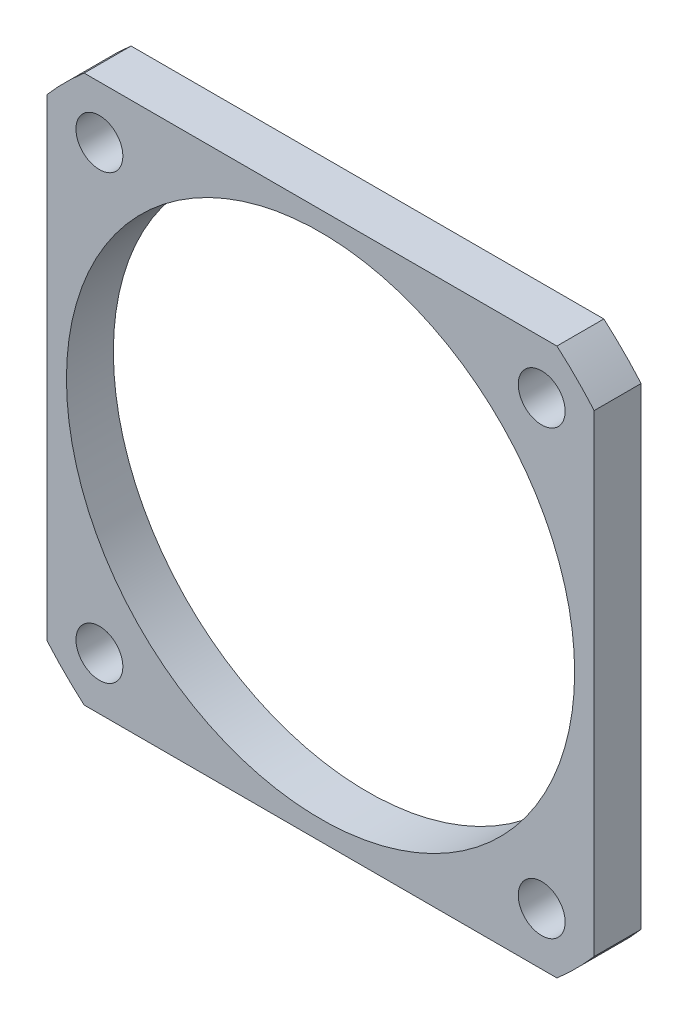
ISO-10303-21;
HEADER;
FILE_DESCRIPTION(('STEP AP214'),'2;1');
FILE_NAME('part.step','',(''),(''),'','','');
FILE_SCHEMA(('AUTOMOTIVE_DESIGN { 1 0 10303 214 1 1 1 1 }'));
ENDSEC;
DATA;
#1=APPLICATION_CONTEXT('core data for automotive mechanical design processes');
#2=APPLICATION_PROTOCOL_DEFINITION('international standard','automotive_design',2000,#1);
#3=PRODUCT_CONTEXT('',#1,'mechanical');
#4=PRODUCT('Part','Part','',(#3));
#5=PRODUCT_RELATED_PRODUCT_CATEGORY('part','',(#4));
#6=PRODUCT_DEFINITION_FORMATION('','',#4);
#7=PRODUCT_DEFINITION_CONTEXT('part definition',#1,'design');
#8=PRODUCT_DEFINITION('design','',#6,#7);
#9=PRODUCT_DEFINITION_SHAPE('','',#8);
#10=(LENGTH_UNIT() NAMED_UNIT(*) SI_UNIT(.MILLI.,.METRE.));
#11=(NAMED_UNIT(*) PLANE_ANGLE_UNIT() SI_UNIT($,.RADIAN.));
#12=(NAMED_UNIT(*) SI_UNIT($,.STERADIAN.) SOLID_ANGLE_UNIT());
#13=UNCERTAINTY_MEASURE_WITH_UNIT(LENGTH_MEASURE(1.E-05),#10,'distance_accuracy_value','');
#14=(GEOMETRIC_REPRESENTATION_CONTEXT(3) GLOBAL_UNCERTAINTY_ASSIGNED_CONTEXT((#13)) GLOBAL_UNIT_ASSIGNED_CONTEXT((#10,
#11,#12)) REPRESENTATION_CONTEXT('',''));
#15=CARTESIAN_POINT('',(0.,0.,0.));
#16=DIRECTION('',(0.,0.,1.));
#17=DIRECTION('',(1.,0.,0.));
#18=AXIS2_PLACEMENT_3D('',#15,#16,#17);
#19=CARTESIAN_POINT('',(0.,0.,12.));
#20=DIRECTION('',(0.,0.,-1.));
#21=DIRECTION('',(-1.,0.,0.));
#22=AXIS2_PLACEMENT_3D('',#19,#20,#21);
#23=CYLINDRICAL_SURFACE('',#22,92.5);
#24=DIRECTION('',(0.,0.,-1.));
#25=VECTOR('',#24,1.);
#26=CARTESIAN_POINT('',(-70.,60.4669331122391,12.));
#27=LINE('',#26,#25);
#28=CARTESIAN_POINT('',(-70.,60.4669331122391,12.));
#29=VERTEX_POINT('',#28);
#30=CARTESIAN_POINT('',(-70.,60.4669331122391,0.));
#31=VERTEX_POINT('',#30);
#32=EDGE_CURVE('E127',#29,#31,#27,.T.);
#33=ORIENTED_EDGE('',*,*,#32,.F.);
#34=CARTESIAN_POINT('',(0.,0.,12.));
#35=DIRECTION('',(0.,0.,1.));
#36=DIRECTION('',(1.,0.,0.));
#37=AXIS2_PLACEMENT_3D('',#34,#35,#36);
#38=CIRCLE('',#37,92.5);
#39=CARTESIAN_POINT('',(-60.4669331122391,70.,12.));
#40=VERTEX_POINT('',#39);
#41=EDGE_CURVE('E118',#40,#29,#38,.T.);
#42=ORIENTED_EDGE('',*,*,#41,.F.);
#43=DIRECTION('',(0.,0.,-1.));
#44=VECTOR('',#43,1.);
#45=CARTESIAN_POINT('',(-60.4669331122391,70.,12.));
#46=LINE('',#45,#44);
#47=CARTESIAN_POINT('',(-60.4669331122391,70.,0.));
#48=VERTEX_POINT('',#47);
#49=EDGE_CURVE('E139',#48,#40,#46,.F.);
#50=ORIENTED_EDGE('',*,*,#49,.F.);
#51=CARTESIAN_POINT('',(0.,0.,0.));
#52=DIRECTION('',(0.,0.,1.));
#53=DIRECTION('',(1.,0.,0.));
#54=AXIS2_PLACEMENT_3D('',#51,#52,#53);
#55=CIRCLE('',#54,92.5);
#56=EDGE_CURVE('E131',#48,#31,#55,.T.);
#57=ORIENTED_EDGE('',*,*,#56,.T.);
#58=EDGE_LOOP('',(#33,#42,#50,#57));
#59=FACE_BOUND('',#58,.T.);
#60=ADVANCED_FACE('F33',(#59),#23,.T.);
#61=DIRECTION('',(0.,0.,-1.));
#62=VECTOR('',#61,1.);
#63=CARTESIAN_POINT('',(-70.,-60.4669331122391,12.));
#64=LINE('',#63,#62);
#65=CARTESIAN_POINT('',(-70.,-60.4669331122391,0.));
#66=VERTEX_POINT('',#65);
#67=CARTESIAN_POINT('',(-70.,-60.4669331122391,12.));
#68=VERTEX_POINT('',#67);
#69=EDGE_CURVE('E156',#66,#68,#64,.F.);
#70=ORIENTED_EDGE('',*,*,#69,.F.);
#71=CARTESIAN_POINT('',(-60.4669331122391,-70.,0.));
#72=VERTEX_POINT('',#71);
#73=EDGE_CURVE('E112',#66,#72,#55,.T.);
#74=ORIENTED_EDGE('',*,*,#73,.T.);
#75=DIRECTION('',(0.,0.,-1.));
#76=VECTOR('',#75,1.);
#77=CARTESIAN_POINT('',(-60.4669331122391,-70.,12.));
#78=LINE('',#77,#76);
#79=CARTESIAN_POINT('',(-60.4669331122391,-70.,12.));
#80=VERTEX_POINT('',#79);
#81=EDGE_CURVE('E55',#80,#72,#78,.T.);
#82=ORIENTED_EDGE('',*,*,#81,.F.);
#83=EDGE_CURVE('E110',#68,#80,#38,.T.);
#84=ORIENTED_EDGE('',*,*,#83,.F.);
#85=EDGE_LOOP('',(#70,#74,#82,#84));
#86=FACE_BOUND('',#85,.T.);
#87=ADVANCED_FACE('F109',(#86),#23,.T.);
#88=DIRECTION('',(0.,0.,-1.));
#89=VECTOR('',#88,1.);
#90=CARTESIAN_POINT('',(60.4669331122391,70.,12.));
#91=LINE('',#90,#89);
#92=CARTESIAN_POINT('',(60.4669331122391,70.,12.));
#93=VERTEX_POINT('',#92);
#94=CARTESIAN_POINT('',(60.4669331122391,70.,0.));
#95=VERTEX_POINT('',#94);
#96=EDGE_CURVE('E142',#93,#95,#91,.T.);
#97=ORIENTED_EDGE('',*,*,#96,.F.);
#98=CARTESIAN_POINT('',(70.,60.4669331122391,12.));
#99=VERTEX_POINT('',#98);
#100=EDGE_CURVE('E121',#99,#93,#38,.T.);
#101=ORIENTED_EDGE('',*,*,#100,.F.);
#102=DIRECTION('',(0.,0.,-1.));
#103=VECTOR('',#102,1.);
#104=CARTESIAN_POINT('',(70.,60.4669331122391,12.));
#105=LINE('',#104,#103);
#106=CARTESIAN_POINT('',(70.,60.4669331122391,0.));
#107=VERTEX_POINT('',#106);
#108=EDGE_CURVE('E113',#107,#99,#105,.F.);
#109=ORIENTED_EDGE('',*,*,#108,.F.);
#110=EDGE_CURVE('E122',#107,#95,#55,.T.);
#111=ORIENTED_EDGE('',*,*,#110,.T.);
#112=EDGE_LOOP('',(#97,#101,#109,#111));
#113=FACE_BOUND('',#112,.T.);
#114=ADVANCED_FACE('F233',(#113),#23,.T.);
#115=DIRECTION('',(0.,0.,-1.));
#116=VECTOR('',#115,1.);
#117=CARTESIAN_POINT('',(70.,-60.4669331122391,12.));
#118=LINE('',#117,#116);
#119=CARTESIAN_POINT('',(70.,-60.4669331122391,12.));
#120=VERTEX_POINT('',#119);
#121=CARTESIAN_POINT('',(70.,-60.4669331122391,0.));
#122=VERTEX_POINT('',#121);
#123=EDGE_CURVE('E47',#120,#122,#118,.T.);
#124=ORIENTED_EDGE('',*,*,#123,.F.);
#125=CARTESIAN_POINT('',(60.4669331122391,-70.,12.));
#126=VERTEX_POINT('',#125);
#127=EDGE_CURVE('E119',#126,#120,#38,.T.);
#128=ORIENTED_EDGE('',*,*,#127,.F.);
#129=DIRECTION('',(0.,0.,-1.));
#130=VECTOR('',#129,1.);
#131=CARTESIAN_POINT('',(60.4669331122391,-70.,12.));
#132=LINE('',#131,#130);
#133=CARTESIAN_POINT('',(60.4669331122391,-70.,0.));
#134=VERTEX_POINT('',#133);
#135=EDGE_CURVE('E97',#134,#126,#132,.F.);
#136=ORIENTED_EDGE('',*,*,#135,.F.);
#137=EDGE_CURVE('E132',#134,#122,#55,.T.);
#138=ORIENTED_EDGE('',*,*,#137,.T.);
#139=EDGE_LOOP('',(#124,#128,#136,#138));
#140=FACE_BOUND('',#139,.T.);
#141=ADVANCED_FACE('F203',(#140),#23,.T.);
#142=CARTESIAN_POINT('',(0.,0.,12.));
#143=DIRECTION('',(0.,0.,1.));
#144=DIRECTION('',(1.,0.,0.));
#145=AXIS2_PLACEMENT_3D('',#142,#143,#144);
#146=PLANE('',#145);
#147=CARTESIAN_POINT('',(56.5685424949237,56.5685424949239,12.));
#148=DIRECTION('',(0.,0.,1.));
#149=DIRECTION('',(1.,0.,0.));
#150=AXIS2_PLACEMENT_3D('',#147,#148,#149);
#151=CIRCLE('',#150,5.99999999999998);
#152=CARTESIAN_POINT('',(62.5685424949237,56.5685424949239,12.));
#153=VERTEX_POINT('',#152);
#154=EDGE_CURVE('E195',#153,#153,#151,.T.);
#155=ORIENTED_EDGE('',*,*,#154,.F.);
#156=EDGE_LOOP('',(#155));
#157=FACE_BOUND('',#156,.T.);
#158=CARTESIAN_POINT('',(-56.5685424949237,56.5685424949239,12.));
#159=DIRECTION('',(0.,0.,1.));
#160=DIRECTION('',(1.,0.,0.));
#161=AXIS2_PLACEMENT_3D('',#158,#159,#160);
#162=CIRCLE('',#161,5.99999999999999);
#163=CARTESIAN_POINT('',(-50.5685424949237,56.5685424949239,12.));
#164=VERTEX_POINT('',#163);
#165=EDGE_CURVE('E189',#164,#164,#162,.T.);
#166=ORIENTED_EDGE('',*,*,#165,.F.);
#167=EDGE_LOOP('',(#166));
#168=FACE_BOUND('',#167,.T.);
#169=CARTESIAN_POINT('',(-56.5685424949237,-56.5685424949239,12.));
#170=DIRECTION('',(0.,0.,1.));
#171=DIRECTION('',(1.,0.,0.));
#172=AXIS2_PLACEMENT_3D('',#169,#170,#171);
#173=CIRCLE('',#172,5.99999999999999);
#174=CARTESIAN_POINT('',(-50.5685424949237,-56.5685424949239,12.));
#175=VERTEX_POINT('',#174);
#176=EDGE_CURVE('E183',#175,#175,#173,.T.);
#177=ORIENTED_EDGE('',*,*,#176,.F.);
#178=EDGE_LOOP('',(#177));
#179=FACE_BOUND('',#178,.T.);
#180=CARTESIAN_POINT('',(56.5685424949237,-56.5685424949239,12.));
#181=DIRECTION('',(0.,0.,1.));
#182=DIRECTION('',(1.,0.,0.));
#183=AXIS2_PLACEMENT_3D('',#180,#181,#182);
#184=CIRCLE('',#183,5.99999999999998);
#185=CARTESIAN_POINT('',(62.5685424949237,-56.5685424949239,12.));
#186=VERTEX_POINT('',#185);
#187=EDGE_CURVE('E177',#186,#186,#184,.T.);
#188=ORIENTED_EDGE('',*,*,#187,.F.);
#189=EDGE_LOOP('',(#188));
#190=FACE_BOUND('',#189,.T.);
#191=CARTESIAN_POINT('',(0.,0.,12.));
#192=DIRECTION('',(0.,0.,1.));
#193=DIRECTION('',(1.,0.,0.));
#194=AXIS2_PLACEMENT_3D('',#191,#192,#193);
#195=CIRCLE('',#194,65.);
#196=CARTESIAN_POINT('',(65.,0.,12.));
#197=VERTEX_POINT('',#196);
#198=EDGE_CURVE('E169',#197,#197,#195,.T.);
#199=ORIENTED_EDGE('',*,*,#198,.F.);
#200=EDGE_LOOP('',(#199));
#201=FACE_BOUND('',#200,.T.);
#202=ORIENTED_EDGE('',*,*,#41,.T.);
#203=DIRECTION('',(0.,-1.,0.));
#204=VECTOR('',#203,1.);
#205=CARTESIAN_POINT('',(-70.,70.,12.));
#206=LINE('',#205,#204);
#207=EDGE_CURVE('E103',#29,#68,#206,.T.);
#208=ORIENTED_EDGE('',*,*,#207,.T.);
#209=ORIENTED_EDGE('',*,*,#83,.T.);
#210=DIRECTION('',(1.,0.,0.));
#211=VECTOR('',#210,1.);
#212=CARTESIAN_POINT('',(-70.,-70.,12.));
#213=LINE('',#212,#211);
#214=EDGE_CURVE('E94',#80,#126,#213,.T.);
#215=ORIENTED_EDGE('',*,*,#214,.T.);
#216=ORIENTED_EDGE('',*,*,#127,.T.);
#217=DIRECTION('',(0.,1.,0.));
#218=VECTOR('',#217,1.);
#219=CARTESIAN_POINT('',(70.,70.,12.));
#220=LINE('',#219,#218);
#221=EDGE_CURVE('E102',#120,#99,#220,.T.);
#222=ORIENTED_EDGE('',*,*,#221,.T.);
#223=ORIENTED_EDGE('',*,*,#100,.T.);
#224=DIRECTION('',(-1.,0.,0.));
#225=VECTOR('',#224,1.);
#226=CARTESIAN_POINT('',(-70.,70.,12.));
#227=LINE('',#226,#225);
#228=EDGE_CURVE('E163',#93,#40,#227,.T.);
#229=ORIENTED_EDGE('',*,*,#228,.T.);
#230=EDGE_LOOP('',(#202,#208,#209,#215,#216,#222,#223,#229));
#231=FACE_BOUND('',#230,.T.);
#232=ADVANCED_FACE('F117',(#157,#168,#179,#190,#201,#231),#146,.T.);
#233=CARTESIAN_POINT('',(0.,0.,0.));
#234=DIRECTION('',(0.,0.,1.));
#235=DIRECTION('',(1.,0.,0.));
#236=AXIS2_PLACEMENT_3D('',#233,#234,#235);
#237=PLANE('',#236);
#238=CARTESIAN_POINT('',(56.5685424949237,56.5685424949239,0.));
#239=DIRECTION('',(0.,0.,1.));
#240=DIRECTION('',(1.,0.,0.));
#241=AXIS2_PLACEMENT_3D('',#238,#239,#240);
#242=CIRCLE('',#241,6.);
#243=CARTESIAN_POINT('',(62.5685424949237,56.5685424949239,0.));
#244=VERTEX_POINT('',#243);
#245=EDGE_CURVE('E192',#244,#244,#242,.T.);
#246=ORIENTED_EDGE('',*,*,#245,.T.);
#247=EDGE_LOOP('',(#246));
#248=FACE_BOUND('',#247,.T.);
#249=CARTESIAN_POINT('',(-56.5685424949237,56.5685424949239,0.));
#250=DIRECTION('',(0.,0.,1.));
#251=DIRECTION('',(1.,0.,0.));
#252=AXIS2_PLACEMENT_3D('',#249,#250,#251);
#253=CIRCLE('',#252,6.);
#254=CARTESIAN_POINT('',(-50.5685424949237,56.5685424949239,0.));
#255=VERTEX_POINT('',#254);
#256=EDGE_CURVE('E186',#255,#255,#253,.T.);
#257=ORIENTED_EDGE('',*,*,#256,.T.);
#258=EDGE_LOOP('',(#257));
#259=FACE_BOUND('',#258,.T.);
#260=CARTESIAN_POINT('',(-56.5685424949237,-56.5685424949239,0.));
#261=DIRECTION('',(0.,0.,1.));
#262=DIRECTION('',(1.,0.,0.));
#263=AXIS2_PLACEMENT_3D('',#260,#261,#262);
#264=CIRCLE('',#263,6.);
#265=CARTESIAN_POINT('',(-50.5685424949237,-56.5685424949239,0.));
#266=VERTEX_POINT('',#265);
#267=EDGE_CURVE('E180',#266,#266,#264,.T.);
#268=ORIENTED_EDGE('',*,*,#267,.T.);
#269=EDGE_LOOP('',(#268));
#270=FACE_BOUND('',#269,.T.);
#271=CARTESIAN_POINT('',(56.5685424949237,-56.5685424949239,0.));
#272=DIRECTION('',(0.,0.,1.));
#273=DIRECTION('',(1.,0.,0.));
#274=AXIS2_PLACEMENT_3D('',#271,#272,#273);
#275=CIRCLE('',#274,6.);
#276=CARTESIAN_POINT('',(62.5685424949237,-56.5685424949239,0.));
#277=VERTEX_POINT('',#276);
#278=EDGE_CURVE('E172',#277,#277,#275,.T.);
#279=ORIENTED_EDGE('',*,*,#278,.T.);
#280=EDGE_LOOP('',(#279));
#281=FACE_BOUND('',#280,.T.);
#282=CARTESIAN_POINT('',(0.,0.,0.));
#283=DIRECTION('',(0.,0.,1.));
#284=DIRECTION('',(1.,0.,0.));
#285=AXIS2_PLACEMENT_3D('',#282,#283,#284);
#286=CIRCLE('',#285,65.);
#287=CARTESIAN_POINT('',(65.,0.,0.));
#288=VERTEX_POINT('',#287);
#289=EDGE_CURVE('E168',#288,#288,#286,.T.);
#290=ORIENTED_EDGE('',*,*,#289,.T.);
#291=EDGE_LOOP('',(#290));
#292=FACE_BOUND('',#291,.T.);
#293=DIRECTION('',(0.,-1.,0.));
#294=VECTOR('',#293,1.);
#295=CARTESIAN_POINT('',(-70.,0.,0.));
#296=LINE('',#295,#294);
#297=EDGE_CURVE('E12',#31,#66,#296,.T.);
#298=ORIENTED_EDGE('',*,*,#297,.F.);
#299=ORIENTED_EDGE('',*,*,#56,.F.);
#300=DIRECTION('',(-1.,0.,0.));
#301=VECTOR('',#300,1.);
#302=CARTESIAN_POINT('',(0.,70.,0.));
#303=LINE('',#302,#301);
#304=EDGE_CURVE('E40',#95,#48,#303,.T.);
#305=ORIENTED_EDGE('',*,*,#304,.F.);
#306=ORIENTED_EDGE('',*,*,#110,.F.);
#307=DIRECTION('',(0.,1.,0.));
#308=VECTOR('',#307,1.);
#309=CARTESIAN_POINT('',(70.,0.,0.));
#310=LINE('',#309,#308);
#311=EDGE_CURVE('E134',#122,#107,#310,.T.);
#312=ORIENTED_EDGE('',*,*,#311,.F.);
#313=ORIENTED_EDGE('',*,*,#137,.F.);
#314=DIRECTION('',(1.,0.,0.));
#315=VECTOR('',#314,1.);
#316=CARTESIAN_POINT('',(0.,-70.,0.));
#317=LINE('',#316,#315);
#318=EDGE_CURVE('E126',#72,#134,#317,.T.);
#319=ORIENTED_EDGE('',*,*,#318,.F.);
#320=ORIENTED_EDGE('',*,*,#73,.F.);
#321=EDGE_LOOP('',(#298,#299,#305,#306,#312,#313,#319,#320));
#322=FACE_BOUND('',#321,.T.);
#323=ADVANCED_FACE('F152',(#248,#259,#270,#281,#292,#322),#237,.F.);
#324=CARTESIAN_POINT('',(-70.,-70.,0.));
#325=DIRECTION('',(0.,-1.,0.));
#326=DIRECTION('',(0.,0.,-1.));
#327=AXIS2_PLACEMENT_3D('',#324,#325,#326);
#328=PLANE('',#327);
#329=ORIENTED_EDGE('',*,*,#81,.T.);
#330=ORIENTED_EDGE('',*,*,#318,.T.);
#331=ORIENTED_EDGE('',*,*,#135,.T.);
#332=ORIENTED_EDGE('',*,*,#214,.F.);
#333=EDGE_LOOP('',(#329,#330,#331,#332));
#334=FACE_BOUND('',#333,.T.);
#335=ADVANCED_FACE('F95',(#334),#328,.T.);
#336=CARTESIAN_POINT('',(70.,70.,0.));
#337=DIRECTION('',(1.,0.,0.));
#338=DIRECTION('',(0.,1.,0.));
#339=AXIS2_PLACEMENT_3D('',#336,#337,#338);
#340=PLANE('',#339);
#341=ORIENTED_EDGE('',*,*,#123,.T.);
#342=ORIENTED_EDGE('',*,*,#311,.T.);
#343=ORIENTED_EDGE('',*,*,#108,.T.);
#344=ORIENTED_EDGE('',*,*,#221,.F.);
#345=EDGE_LOOP('',(#341,#342,#343,#344));
#346=FACE_BOUND('',#345,.T.);
#347=ADVANCED_FACE('F241',(#346),#340,.T.);
#348=CARTESIAN_POINT('',(-70.,70.,0.));
#349=DIRECTION('',(0.,1.,0.));
#350=DIRECTION('',(0.,0.,1.));
#351=AXIS2_PLACEMENT_3D('',#348,#349,#350);
#352=PLANE('',#351);
#353=ORIENTED_EDGE('',*,*,#96,.T.);
#354=ORIENTED_EDGE('',*,*,#304,.T.);
#355=ORIENTED_EDGE('',*,*,#49,.T.);
#356=ORIENTED_EDGE('',*,*,#228,.F.);
#357=EDGE_LOOP('',(#353,#354,#355,#356));
#358=FACE_BOUND('',#357,.T.);
#359=ADVANCED_FACE('F138',(#358),#352,.T.);
#360=CARTESIAN_POINT('',(-70.,70.,0.));
#361=DIRECTION('',(-1.,0.,0.));
#362=DIRECTION('',(0.,-1.,0.));
#363=AXIS2_PLACEMENT_3D('',#360,#361,#362);
#364=PLANE('',#363);
#365=ORIENTED_EDGE('',*,*,#32,.T.);
#366=ORIENTED_EDGE('',*,*,#297,.T.);
#367=ORIENTED_EDGE('',*,*,#69,.T.);
#368=ORIENTED_EDGE('',*,*,#207,.F.);
#369=EDGE_LOOP('',(#365,#366,#367,#368));
#370=FACE_BOUND('',#369,.T.);
#371=ADVANCED_FACE('F216',(#370),#364,.T.);
#372=CARTESIAN_POINT('',(0.,0.,0.));
#373=DIRECTION('',(0.,0.,1.));
#374=DIRECTION('',(1.,0.,0.));
#375=AXIS2_PLACEMENT_3D('',#372,#373,#374);
#376=CYLINDRICAL_SURFACE('',#375,65.);
#377=ORIENTED_EDGE('',*,*,#289,.F.);
#378=EDGE_LOOP('',(#377));
#379=FACE_BOUND('',#378,.T.);
#380=ORIENTED_EDGE('',*,*,#198,.T.);
#381=EDGE_LOOP('',(#380));
#382=FACE_BOUND('',#381,.T.);
#383=ADVANCED_FACE('F213',(#379,#382),#376,.F.);
#384=CARTESIAN_POINT('',(56.5685424949237,-56.5685424949239,12.));
#385=DIRECTION('',(0.,0.,1.));
#386=DIRECTION('',(1.,0.,0.));
#387=AXIS2_PLACEMENT_3D('',#384,#385,#386);
#388=CYLINDRICAL_SURFACE('',#387,5.99999999999999);
#389=ORIENTED_EDGE('',*,*,#278,.F.);
#390=EDGE_LOOP('',(#389));
#391=FACE_BOUND('',#390,.T.);
#392=ORIENTED_EDGE('',*,*,#187,.T.);
#393=EDGE_LOOP('',(#392));
#394=FACE_BOUND('',#393,.T.);
#395=ADVANCED_FACE('F215',(#391,#394),#388,.F.);
#396=CARTESIAN_POINT('',(-56.5685424949237,-56.5685424949239,12.));
#397=DIRECTION('',(0.,0.,1.));
#398=DIRECTION('',(1.,0.,0.));
#399=AXIS2_PLACEMENT_3D('',#396,#397,#398);
#400=CYLINDRICAL_SURFACE('',#399,5.99999999999999);
#401=ORIENTED_EDGE('',*,*,#267,.F.);
#402=EDGE_LOOP('',(#401));
#403=FACE_BOUND('',#402,.T.);
#404=ORIENTED_EDGE('',*,*,#176,.T.);
#405=EDGE_LOOP('',(#404));
#406=FACE_BOUND('',#405,.T.);
#407=ADVANCED_FACE('F223',(#403,#406),#400,.F.);
#408=CARTESIAN_POINT('',(-56.5685424949237,56.5685424949239,12.));
#409=DIRECTION('',(0.,0.,1.));
#410=DIRECTION('',(1.,0.,0.));
#411=AXIS2_PLACEMENT_3D('',#408,#409,#410);
#412=CYLINDRICAL_SURFACE('',#411,5.99999999999999);
#413=ORIENTED_EDGE('',*,*,#256,.F.);
#414=EDGE_LOOP('',(#413));
#415=FACE_BOUND('',#414,.T.);
#416=ORIENTED_EDGE('',*,*,#165,.T.);
#417=EDGE_LOOP('',(#416));
#418=FACE_BOUND('',#417,.T.);
#419=ADVANCED_FACE('F265',(#415,#418),#412,.F.);
#420=CARTESIAN_POINT('',(56.5685424949237,56.5685424949239,12.));
#421=DIRECTION('',(0.,0.,1.));
#422=DIRECTION('',(1.,0.,0.));
#423=AXIS2_PLACEMENT_3D('',#420,#421,#422);
#424=CYLINDRICAL_SURFACE('',#423,5.99999999999999);
#425=ORIENTED_EDGE('',*,*,#245,.F.);
#426=EDGE_LOOP('',(#425));
#427=FACE_BOUND('',#426,.T.);
#428=ORIENTED_EDGE('',*,*,#154,.T.);
#429=EDGE_LOOP('',(#428));
#430=FACE_BOUND('',#429,.T.);
#431=ADVANCED_FACE('F199',(#427,#430),#424,.F.);
#432=CLOSED_SHELL('',(#60,#87,#114,#141,#232,#323,#335,#347,#359,#371,#383,#395,#407,#419,#431));
#433=MANIFOLD_SOLID_BREP('B2',#432);
#434=ADVANCED_BREP_SHAPE_REPRESENTATION('',(#18,#433),#14);
#435=SHAPE_DEFINITION_REPRESENTATION(#9,#434);
ENDSEC;
END-ISO-10303-21;
